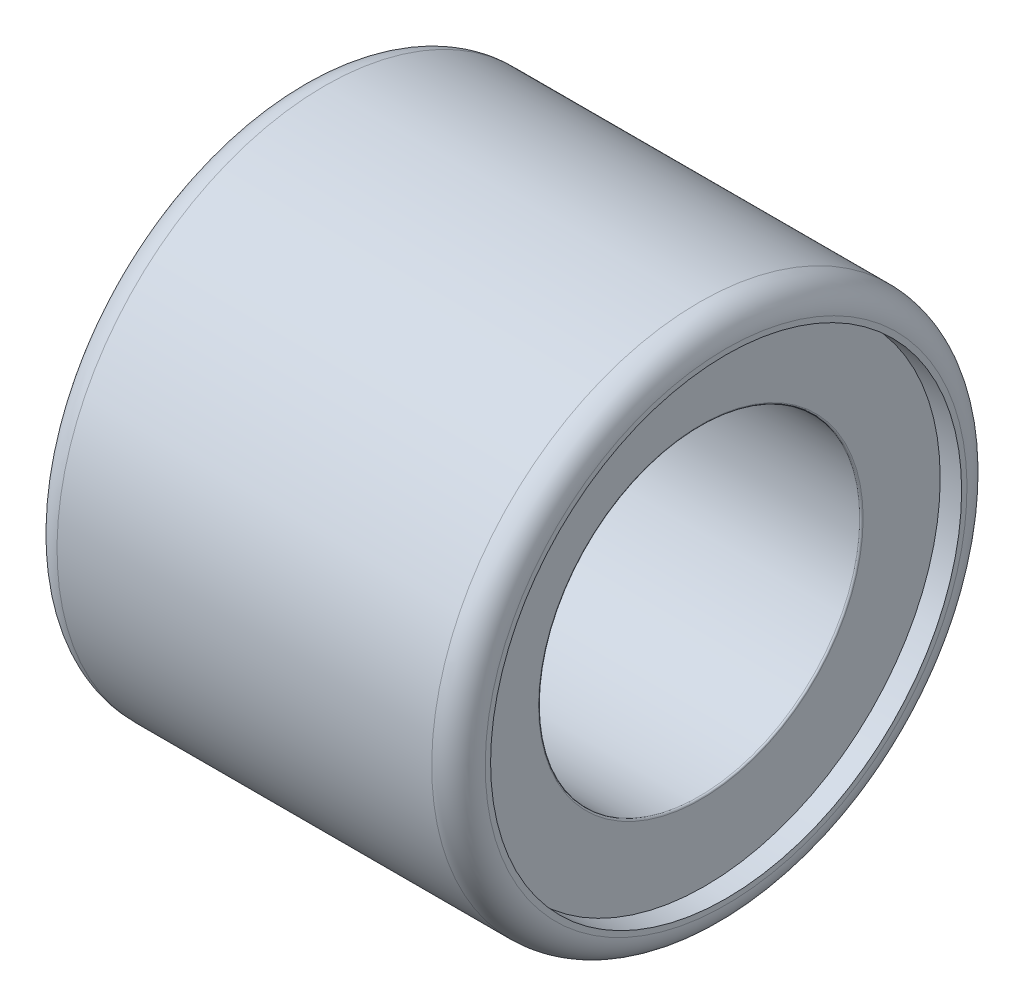
ISO-10303-21;
HEADER;
FILE_DESCRIPTION(('STEP AP214'),'2;1');
FILE_NAME('part.step','',(''),(''),'','','');
FILE_SCHEMA(('AUTOMOTIVE_DESIGN { 1 0 10303 214 1 1 1 1 }'));
ENDSEC;
DATA;
#1=APPLICATION_CONTEXT('core data for automotive mechanical design processes');
#2=APPLICATION_PROTOCOL_DEFINITION('international standard','automotive_design',2000,#1);
#3=PRODUCT_CONTEXT('',#1,'mechanical');
#4=PRODUCT('Part','Part','',(#3));
#5=PRODUCT_RELATED_PRODUCT_CATEGORY('part','',(#4));
#6=PRODUCT_DEFINITION_FORMATION('','',#4);
#7=PRODUCT_DEFINITION_CONTEXT('part definition',#1,'design');
#8=PRODUCT_DEFINITION('design','',#6,#7);
#9=PRODUCT_DEFINITION_SHAPE('','',#8);
#10=(LENGTH_UNIT() NAMED_UNIT(*) SI_UNIT(.MILLI.,.METRE.));
#11=(NAMED_UNIT(*) PLANE_ANGLE_UNIT() SI_UNIT($,.RADIAN.));
#12=(NAMED_UNIT(*) SI_UNIT($,.STERADIAN.) SOLID_ANGLE_UNIT());
#13=UNCERTAINTY_MEASURE_WITH_UNIT(LENGTH_MEASURE(1.E-05),#10,'distance_accuracy_value','');
#14=(GEOMETRIC_REPRESENTATION_CONTEXT(3) GLOBAL_UNCERTAINTY_ASSIGNED_CONTEXT((#13)) GLOBAL_UNIT_ASSIGNED_CONTEXT((#10,
#11,#12)) REPRESENTATION_CONTEXT('',''));
#15=CARTESIAN_POINT('',(0.,0.,0.));
#16=DIRECTION('',(0.,0.,1.));
#17=DIRECTION('',(1.,0.,0.));
#18=AXIS2_PLACEMENT_3D('',#15,#16,#17);
#19=CARTESIAN_POINT('',(-44.2039167842588,-23.3729354259102,22.4509895253785));
#20=DIRECTION('',(1.,0.,0.));
#21=DIRECTION('',(0.,1.,0.));
#22=AXIS2_PLACEMENT_3D('',#19,#20,#21);
#23=CYLINDRICAL_SURFACE('',#22,4.59999999999999);
#24=CARTESIAN_POINT('',(-8.85391678425878,-23.3729354259102,22.4509895253785));
#25=DIRECTION('',(1.,0.,0.));
#26=DIRECTION('',(0.,1.,0.));
#27=AXIS2_PLACEMENT_3D('',#24,#25,#26);
#28=CIRCLE('',#27,4.59999999999999);
#29=CARTESIAN_POINT('',(-8.85391678425878,-18.7729354259102,22.4509895253785));
#30=VERTEX_POINT('',#29);
#31=EDGE_CURVE('E81',#30,#30,#28,.T.);
#32=ORIENTED_EDGE('',*,*,#31,.T.);
#33=EDGE_LOOP('',(#32));
#34=FACE_BOUND('',#33,.T.);
#35=CARTESIAN_POINT('',(-8.94999701096225,-23.3729354259102,22.4509895253785));
#36=DIRECTION('',(-1.,0.,0.));
#37=DIRECTION('',(0.,0.,1.));
#38=AXIS2_PLACEMENT_3D('',#35,#36,#37);
#39=CIRCLE('',#38,4.59999999999999);
#40=CARTESIAN_POINT('',(-8.94999701096225,-23.3729354259102,27.0509895253785));
#41=VERTEX_POINT('',#40);
#42=EDGE_CURVE('E43',#41,#41,#39,.T.);
#43=ORIENTED_EDGE('',*,*,#42,.T.);
#44=EDGE_LOOP('',(#43));
#45=FACE_BOUND('',#44,.T.);
#46=ADVANCED_FACE('F39',(#34,#45),#23,.F.);
#47=CARTESIAN_POINT('',(-16.0539167842588,-23.3729354259102,22.4509895253785));
#48=DIRECTION('',(1.,0.,0.));
#49=DIRECTION('',(0.,1.,0.));
#50=AXIS2_PLACEMENT_3D('',#47,#48,#49);
#51=CIRCLE('',#50,4.59999999999999);
#52=CARTESIAN_POINT('',(-16.0539167842588,-18.7729354259102,22.4509895253785));
#53=VERTEX_POINT('',#52);
#54=EDGE_CURVE('E66',#53,#53,#51,.T.);
#55=ORIENTED_EDGE('',*,*,#54,.F.);
#56=EDGE_LOOP('',(#55));
#57=FACE_BOUND('',#56,.T.);
#58=CARTESIAN_POINT('',(-15.9578365575553,-23.3729354259102,22.4509895253785));
#59=DIRECTION('',(1.,0.,0.));
#60=DIRECTION('',(0.,0.,-1.));
#61=AXIS2_PLACEMENT_3D('',#58,#59,#60);
#62=CIRCLE('',#61,4.59999999999999);
#63=CARTESIAN_POINT('',(-15.9578365575553,-23.3729354259102,17.8509895253785));
#64=VERTEX_POINT('',#63);
#65=EDGE_CURVE('E57',#64,#64,#62,.T.);
#66=ORIENTED_EDGE('',*,*,#65,.T.);
#67=EDGE_LOOP('',(#66));
#68=FACE_BOUND('',#67,.T.);
#69=ADVANCED_FACE('F123',(#57,#68),#23,.F.);
#70=CARTESIAN_POINT('',(-16.0539167842588,-18.7729354259102,22.4509895253785));
#71=DIRECTION('',(1.,0.,0.));
#72=DIRECTION('',(0.,1.,0.));
#73=AXIS2_PLACEMENT_3D('',#70,#71,#72);
#74=PLANE('',#73);
#75=ORIENTED_EDGE('',*,*,#54,.T.);
#76=EDGE_LOOP('',(#75));
#77=FACE_BOUND('',#76,.T.);
#78=CARTESIAN_POINT('',(-16.0539167842588,-23.3729354259102,22.4509895253785));
#79=DIRECTION('',(1.,0.,0.));
#80=DIRECTION('',(0.,1.,0.));
#81=AXIS2_PLACEMENT_3D('',#78,#79,#80);
#82=CIRCLE('',#81,4.4);
#83=CARTESIAN_POINT('',(-16.0539167842588,-18.9729354259102,22.4509895253785));
#84=VERTEX_POINT('',#83);
#85=EDGE_CURVE('E10',#84,#84,#82,.T.);
#86=ORIENTED_EDGE('',*,*,#85,.F.);
#87=EDGE_LOOP('',(#86));
#88=FACE_BOUND('',#87,.T.);
#89=ADVANCED_FACE('F41',(#77,#88),#74,.T.);
#90=CARTESIAN_POINT('',(-44.2039167842588,-23.3729354259102,22.4509895253785));
#91=DIRECTION('',(1.,0.,0.));
#92=DIRECTION('',(0.,1.,0.));
#93=AXIS2_PLACEMENT_3D('',#90,#91,#92);
#94=CYLINDRICAL_SURFACE('',#93,4.4);
#95=ORIENTED_EDGE('',*,*,#85,.T.);
#96=EDGE_LOOP('',(#95));
#97=FACE_BOUND('',#96,.T.);
#98=CARTESIAN_POINT('',(-16.4539167842588,-23.3729354259102,22.4509895253785));
#99=DIRECTION('',(1.,0.,0.));
#100=DIRECTION('',(0.,1.,0.));
#101=AXIS2_PLACEMENT_3D('',#98,#99,#100);
#102=CIRCLE('',#101,4.4);
#103=CARTESIAN_POINT('',(-16.4539167842588,-18.9729354259102,22.4509895253785));
#104=VERTEX_POINT('',#103);
#105=EDGE_CURVE('E48',#104,#104,#102,.T.);
#106=ORIENTED_EDGE('',*,*,#105,.F.);
#107=EDGE_LOOP('',(#106));
#108=FACE_BOUND('',#107,.T.);
#109=ADVANCED_FACE('F113',(#97,#108),#94,.F.);
#110=CARTESIAN_POINT('',(-16.4539167842588,-18.9729354259102,22.4509895253785));
#111=DIRECTION('',(-1.,0.,0.));
#112=DIRECTION('',(0.,-1.,0.));
#113=AXIS2_PLACEMENT_3D('',#110,#111,#112);
#114=PLANE('',#113);
#115=ORIENTED_EDGE('',*,*,#105,.T.);
#116=EDGE_LOOP('',(#115));
#117=FACE_BOUND('',#116,.T.);
#118=CARTESIAN_POINT('',(-16.4539167842588,-23.3729354259102,22.4509895253785));
#119=DIRECTION('',(1.,0.,0.));
#120=DIRECTION('',(0.,1.,0.));
#121=AXIS2_PLACEMENT_3D('',#118,#119,#120);
#122=CIRCLE('',#121,4.5);
#123=CARTESIAN_POINT('',(-16.4539167842588,-18.8729354259102,22.4509895253785));
#124=VERTEX_POINT('',#123);
#125=EDGE_CURVE('E54',#124,#124,#122,.T.);
#126=ORIENTED_EDGE('',*,*,#125,.F.);
#127=EDGE_LOOP('',(#126));
#128=FACE_BOUND('',#127,.T.);
#129=ADVANCED_FACE('F111',(#117,#128),#114,.T.);
#130=CARTESIAN_POINT('',(-15.9539167842588,-23.3729354259102,22.4509895253785));
#131=DIRECTION('',(1.,0.,0.));
#132=DIRECTION('',(0.,1.,0.));
#133=AXIS2_PLACEMENT_3D('',#130,#131,#132);
#134=TOROIDAL_SURFACE('',#133,4.5,0.5);
#135=ORIENTED_EDGE('',*,*,#125,.T.);
#136=EDGE_LOOP('',(#135));
#137=FACE_BOUND('',#136,.T.);
#138=CARTESIAN_POINT('',(-15.9539167842588,-23.3729354259102,22.4509895253785));
#139=DIRECTION('',(1.,0.,0.));
#140=DIRECTION('',(0.,1.,0.));
#141=AXIS2_PLACEMENT_3D('',#138,#139,#140);
#142=CIRCLE('',#141,4.99999999999999);
#143=CARTESIAN_POINT('',(-15.9539167842588,-18.3729354259102,22.4509895253785));
#144=VERTEX_POINT('',#143);
#145=EDGE_CURVE('E101',#144,#144,#142,.T.);
#146=ORIENTED_EDGE('',*,*,#145,.F.);
#147=EDGE_LOOP('',(#146));
#148=FACE_BOUND('',#147,.T.);
#149=ADVANCED_FACE('F108',(#137,#148),#134,.T.);
#150=CARTESIAN_POINT('',(-44.2039167842588,-23.3729354259102,22.4509895253785));
#151=DIRECTION('',(1.,0.,0.));
#152=DIRECTION('',(0.,1.,0.));
#153=AXIS2_PLACEMENT_3D('',#150,#151,#152);
#154=CYLINDRICAL_SURFACE('',#153,4.99999999999999);
#155=ORIENTED_EDGE('',*,*,#145,.T.);
#156=EDGE_LOOP('',(#155));
#157=FACE_BOUND('',#156,.T.);
#158=CARTESIAN_POINT('',(-8.95391678425877,-23.3729354259102,22.4509895253785));
#159=DIRECTION('',(1.,0.,0.));
#160=DIRECTION('',(0.,1.,0.));
#161=AXIS2_PLACEMENT_3D('',#158,#159,#160);
#162=CIRCLE('',#161,4.99999999999999);
#163=CARTESIAN_POINT('',(-8.95391678425878,-18.3729354259102,22.4509895253785));
#164=VERTEX_POINT('',#163);
#165=EDGE_CURVE('E97',#164,#164,#162,.T.);
#166=ORIENTED_EDGE('',*,*,#165,.F.);
#167=EDGE_LOOP('',(#166));
#168=FACE_BOUND('',#167,.T.);
#169=ADVANCED_FACE('F120',(#157,#168),#154,.T.);
#170=CARTESIAN_POINT('',(-8.95391678425878,-23.3729354259102,22.4509895253785));
#171=DIRECTION('',(1.,0.,0.));
#172=DIRECTION('',(0.,1.,0.));
#173=AXIS2_PLACEMENT_3D('',#170,#171,#172);
#174=TOROIDAL_SURFACE('',#173,4.49999999999999,0.5);
#175=ORIENTED_EDGE('',*,*,#165,.T.);
#176=EDGE_LOOP('',(#175));
#177=FACE_BOUND('',#176,.T.);
#178=CARTESIAN_POINT('',(-8.45391678425877,-23.3729354259102,22.4509895253785));
#179=DIRECTION('',(1.,0.,0.));
#180=DIRECTION('',(0.,1.,0.));
#181=AXIS2_PLACEMENT_3D('',#178,#179,#180);
#182=CIRCLE('',#181,4.49999999999999);
#183=CARTESIAN_POINT('',(-8.45391678425877,-18.8729354259102,22.4509895253785));
#184=VERTEX_POINT('',#183);
#185=EDGE_CURVE('E93',#184,#184,#182,.T.);
#186=ORIENTED_EDGE('',*,*,#185,.F.);
#187=EDGE_LOOP('',(#186));
#188=FACE_BOUND('',#187,.T.);
#189=ADVANCED_FACE('F146',(#177,#188),#174,.T.);
#190=CARTESIAN_POINT('',(-8.45391678425878,-18.8729354259102,22.4509895253785));
#191=DIRECTION('',(1.,0.,0.));
#192=DIRECTION('',(0.,1.,0.));
#193=AXIS2_PLACEMENT_3D('',#190,#191,#192);
#194=PLANE('',#193);
#195=ORIENTED_EDGE('',*,*,#185,.T.);
#196=EDGE_LOOP('',(#195));
#197=FACE_BOUND('',#196,.T.);
#198=CARTESIAN_POINT('',(-8.45391678425877,-23.3729354259102,22.4509895253785));
#199=DIRECTION('',(1.,0.,0.));
#200=DIRECTION('',(0.,1.,0.));
#201=AXIS2_PLACEMENT_3D('',#198,#199,#200);
#202=CIRCLE('',#201,4.39999999999999);
#203=CARTESIAN_POINT('',(-8.45391678425877,-18.9729354259102,22.4509895253785));
#204=VERTEX_POINT('',#203);
#205=EDGE_CURVE('E89',#204,#204,#202,.T.);
#206=ORIENTED_EDGE('',*,*,#205,.F.);
#207=EDGE_LOOP('',(#206));
#208=FACE_BOUND('',#207,.T.);
#209=ADVANCED_FACE('F142',(#197,#208),#194,.T.);
#210=CARTESIAN_POINT('',(-44.2039167842588,-23.3729354259102,22.4509895253785));
#211=DIRECTION('',(1.,0.,0.));
#212=DIRECTION('',(0.,1.,0.));
#213=AXIS2_PLACEMENT_3D('',#210,#211,#212);
#214=CYLINDRICAL_SURFACE('',#213,4.39999999999999);
#215=ORIENTED_EDGE('',*,*,#205,.T.);
#216=EDGE_LOOP('',(#215));
#217=FACE_BOUND('',#216,.T.);
#218=CARTESIAN_POINT('',(-8.85391678425878,-23.3729354259102,22.4509895253785));
#219=DIRECTION('',(1.,0.,0.));
#220=DIRECTION('',(0.,1.,0.));
#221=AXIS2_PLACEMENT_3D('',#218,#219,#220);
#222=CIRCLE('',#221,4.39999999999999);
#223=CARTESIAN_POINT('',(-8.85391678425878,-18.9729354259102,22.4509895253785));
#224=VERTEX_POINT('',#223);
#225=EDGE_CURVE('E85',#224,#224,#222,.T.);
#226=ORIENTED_EDGE('',*,*,#225,.F.);
#227=EDGE_LOOP('',(#226));
#228=FACE_BOUND('',#227,.T.);
#229=ADVANCED_FACE('F138',(#217,#228),#214,.F.);
#230=CARTESIAN_POINT('',(-8.85391678425878,-18.9729354259102,22.4509895253785));
#231=DIRECTION('',(-1.,0.,0.));
#232=DIRECTION('',(0.,-1.,0.));
#233=AXIS2_PLACEMENT_3D('',#230,#231,#232);
#234=PLANE('',#233);
#235=ORIENTED_EDGE('',*,*,#225,.T.);
#236=EDGE_LOOP('',(#235));
#237=FACE_BOUND('',#236,.T.);
#238=ORIENTED_EDGE('',*,*,#31,.F.);
#239=EDGE_LOOP('',(#238));
#240=FACE_BOUND('',#239,.T.);
#241=ADVANCED_FACE('F135',(#237,#240),#234,.T.);
#242=CARTESIAN_POINT('',(-15.9498967842588,-23.3729354259102,22.4509895253785));
#243=DIRECTION('',(-1.,0.,0.));
#244=DIRECTION('',(0.,0.,1.));
#245=AXIS2_PLACEMENT_3D('',#242,#243,#244);
#246=TOROIDAL_SURFACE('',#245,3.03202,0.03202);
#247=CARTESIAN_POINT('',(-15.9498967842588,-23.3729354259102,22.4509895253785));
#248=DIRECTION('',(-1.,0.,0.));
#249=DIRECTION('',(0.,0.,1.));
#250=AXIS2_PLACEMENT_3D('',#247,#248,#249);
#251=CIRCLE('',#250,3.);
#252=CARTESIAN_POINT('',(-15.9498967842588,-23.3729354259102,25.4509895253785));
#253=VERTEX_POINT('',#252);
#254=EDGE_CURVE('E60',#253,#253,#251,.T.);
#255=ORIENTED_EDGE('',*,*,#254,.F.);
#256=EDGE_LOOP('',(#255));
#257=FACE_BOUND('',#256,.T.);
#258=CARTESIAN_POINT('',(-15.9819167842588,-23.3729354259102,22.4509895253785));
#259=DIRECTION('',(-1.,0.,0.));
#260=DIRECTION('',(0.,0.,1.));
#261=AXIS2_PLACEMENT_3D('',#258,#259,#260);
#262=CIRCLE('',#261,3.03202);
#263=CARTESIAN_POINT('',(-15.9819167842588,-23.3729354259102,25.4830095253785));
#264=VERTEX_POINT('',#263);
#265=EDGE_CURVE('E300',#264,#264,#262,.T.);
#266=ORIENTED_EDGE('',*,*,#265,.T.);
#267=EDGE_LOOP('',(#266));
#268=FACE_BOUND('',#267,.T.);
#269=ADVANCED_FACE('F133',(#257,#268),#246,.T.);
#270=CARTESIAN_POINT('',(-37.8539167842588,-23.3729354259102,22.4509895253785));
#271=DIRECTION('',(-1.,0.,0.));
#272=DIRECTION('',(0.,0.,1.));
#273=AXIS2_PLACEMENT_3D('',#270,#271,#272);
#274=CYLINDRICAL_SURFACE('',#273,3.);
#275=CARTESIAN_POINT('',(-8.95793678425878,-23.3729354259102,22.4509895253785));
#276=DIRECTION('',(-1.,0.,0.));
#277=DIRECTION('',(0.,0.,1.));
#278=AXIS2_PLACEMENT_3D('',#275,#276,#277);
#279=CIRCLE('',#278,3.);
#280=CARTESIAN_POINT('',(-8.95793678425878,-23.3729354259102,25.4509895253785));
#281=VERTEX_POINT('',#280);
#282=EDGE_CURVE('E68',#281,#281,#279,.T.);
#283=ORIENTED_EDGE('',*,*,#282,.F.);
#284=EDGE_LOOP('',(#283));
#285=FACE_BOUND('',#284,.T.);
#286=ORIENTED_EDGE('',*,*,#254,.T.);
#287=EDGE_LOOP('',(#286));
#288=FACE_BOUND('',#287,.T.);
#289=ADVANCED_FACE('F190',(#285,#288),#274,.F.);
#290=CARTESIAN_POINT('',(-8.95793678425878,-23.3729354259102,22.4509895253785));
#291=DIRECTION('',(-1.,0.,0.));
#292=DIRECTION('',(0.,0.,1.));
#293=AXIS2_PLACEMENT_3D('',#290,#291,#292);
#294=TOROIDAL_SURFACE('',#293,3.03202,0.0320200000000004);
#295=CARTESIAN_POINT('',(-8.92591678425878,-23.3729354259102,22.4509895253785));
#296=DIRECTION('',(-1.,0.,0.));
#297=DIRECTION('',(0.,0.,1.));
#298=AXIS2_PLACEMENT_3D('',#295,#296,#297);
#299=CIRCLE('',#298,3.03202);
#300=CARTESIAN_POINT('',(-8.92591678425878,-23.3729354259102,25.4830095253785));
#301=VERTEX_POINT('',#300);
#302=EDGE_CURVE('E74',#301,#301,#299,.T.);
#303=ORIENTED_EDGE('',*,*,#302,.F.);
#304=EDGE_LOOP('',(#303));
#305=FACE_BOUND('',#304,.T.);
#306=ORIENTED_EDGE('',*,*,#282,.T.);
#307=EDGE_LOOP('',(#306));
#308=FACE_BOUND('',#307,.T.);
#309=ADVANCED_FACE('F197',(#305,#308),#294,.T.);
#310=CARTESIAN_POINT('',(-8.92591678425878,-18.8039554259102,22.4509895253785));
#311=DIRECTION('',(-1.,0.,0.));
#312=DIRECTION('',(0.,0.,1.));
#313=AXIS2_PLACEMENT_3D('',#310,#311,#312);
#314=PLANE('',#313);
#315=CARTESIAN_POINT('',(-8.92591678425878,-23.3729354259102,22.4509895253785));
#316=DIRECTION('',(-1.,0.,0.));
#317=DIRECTION('',(0.,0.,1.));
#318=AXIS2_PLACEMENT_3D('',#315,#316,#317);
#319=CIRCLE('',#318,4.56898);
#320=CARTESIAN_POINT('',(-8.92591678425878,-23.3729354259102,27.0199695253785));
#321=VERTEX_POINT('',#320);
#322=EDGE_CURVE('E306',#321,#321,#319,.T.);
#323=ORIENTED_EDGE('',*,*,#322,.F.);
#324=EDGE_LOOP('',(#323));
#325=FACE_BOUND('',#324,.T.);
#326=ORIENTED_EDGE('',*,*,#302,.T.);
#327=EDGE_LOOP('',(#326));
#328=FACE_BOUND('',#327,.T.);
#329=ADVANCED_FACE('F204',(#325,#328),#314,.F.);
#330=CARTESIAN_POINT('',(-8.95793678425878,-23.3729354259102,22.4509895253785));
#331=DIRECTION('',(-1.,0.,0.));
#332=DIRECTION('',(0.,0.,1.));
#333=AXIS2_PLACEMENT_3D('',#330,#331,#332);
#334=TOROIDAL_SURFACE('',#333,4.56898,0.03202);
#335=ORIENTED_EDGE('',*,*,#42,.F.);
#336=EDGE_LOOP('',(#335));
#337=FACE_BOUND('',#336,.T.);
#338=ORIENTED_EDGE('',*,*,#322,.T.);
#339=EDGE_LOOP('',(#338));
#340=FACE_BOUND('',#339,.T.);
#341=ADVANCED_FACE('F212',(#337,#340),#334,.T.);
#342=CARTESIAN_POINT('',(-15.9498967842588,-23.3729354259102,22.4509895253785));
#343=DIRECTION('',(-1.,0.,0.));
#344=DIRECTION('',(0.,0.,1.));
#345=AXIS2_PLACEMENT_3D('',#342,#343,#344);
#346=TOROIDAL_SURFACE('',#345,4.56898,0.0320199999999998);
#347=ORIENTED_EDGE('',*,*,#65,.F.);
#348=EDGE_LOOP('',(#347));
#349=FACE_BOUND('',#348,.T.);
#350=CARTESIAN_POINT('',(-15.9819167842588,-23.3729354259102,22.4509895253785));
#351=DIRECTION('',(-1.,0.,0.));
#352=DIRECTION('',(0.,0.,1.));
#353=AXIS2_PLACEMENT_3D('',#350,#351,#352);
#354=CIRCLE('',#353,4.56898);
#355=CARTESIAN_POINT('',(-15.9819167842588,-23.3729354259102,27.0199695253785));
#356=VERTEX_POINT('',#355);
#357=EDGE_CURVE('E303',#356,#356,#354,.T.);
#358=ORIENTED_EDGE('',*,*,#357,.F.);
#359=EDGE_LOOP('',(#358));
#360=FACE_BOUND('',#359,.T.);
#361=ADVANCED_FACE('F220',(#349,#360),#346,.T.);
#362=CARTESIAN_POINT('',(-15.9819167842588,-18.8039554259102,22.4509895253785));
#363=DIRECTION('',(1.,0.,0.));
#364=DIRECTION('',(0.,0.,-1.));
#365=AXIS2_PLACEMENT_3D('',#362,#363,#364);
#366=PLANE('',#365);
#367=ORIENTED_EDGE('',*,*,#265,.F.);
#368=EDGE_LOOP('',(#367));
#369=FACE_BOUND('',#368,.T.);
#370=ORIENTED_EDGE('',*,*,#357,.T.);
#371=EDGE_LOOP('',(#370));
#372=FACE_BOUND('',#371,.T.);
#373=ADVANCED_FACE('F228',(#369,#372),#366,.F.);
#374=CLOSED_SHELL('',(#46,#69,#89,#109,#129,#149,#169,#189,#209,#229,#241,#269,#289,#309,#329,
#341,#361,#373));
#375=MANIFOLD_SOLID_BREP('B2',#374);
#376=ADVANCED_BREP_SHAPE_REPRESENTATION('',(#18,#375),#14);
#377=SHAPE_DEFINITION_REPRESENTATION(#9,#376);
ENDSEC;
END-ISO-10303-21;
